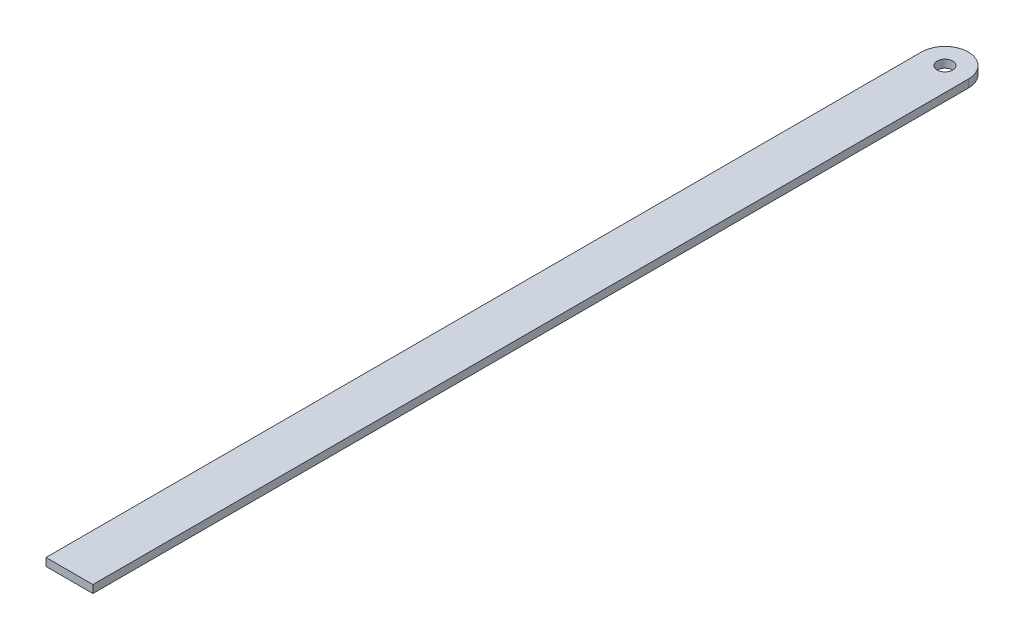
ISO-10303-21;
HEADER;
FILE_DESCRIPTION(('STEP AP214'),'2;1');
FILE_NAME('part.step','',(''),(''),'','','');
FILE_SCHEMA(('AUTOMOTIVE_DESIGN { 1 0 10303 214 1 1 1 1 }'));
ENDSEC;
DATA;
#1=APPLICATION_CONTEXT('core data for automotive mechanical design processes');
#2=APPLICATION_PROTOCOL_DEFINITION('international standard','automotive_design',2000,#1);
#3=PRODUCT_CONTEXT('',#1,'mechanical');
#4=PRODUCT('Part','Part','',(#3));
#5=PRODUCT_RELATED_PRODUCT_CATEGORY('part','',(#4));
#6=PRODUCT_DEFINITION_FORMATION('','',#4);
#7=PRODUCT_DEFINITION_CONTEXT('part definition',#1,'design');
#8=PRODUCT_DEFINITION('design','',#6,#7);
#9=PRODUCT_DEFINITION_SHAPE('','',#8);
#10=(LENGTH_UNIT() NAMED_UNIT(*) SI_UNIT(.MILLI.,.METRE.));
#11=(NAMED_UNIT(*) PLANE_ANGLE_UNIT() SI_UNIT($,.RADIAN.));
#12=(NAMED_UNIT(*) SI_UNIT($,.STERADIAN.) SOLID_ANGLE_UNIT());
#13=UNCERTAINTY_MEASURE_WITH_UNIT(LENGTH_MEASURE(1.E-05),#10,'distance_accuracy_value','');
#14=(GEOMETRIC_REPRESENTATION_CONTEXT(3) GLOBAL_UNCERTAINTY_ASSIGNED_CONTEXT((#13)) GLOBAL_UNIT_ASSIGNED_CONTEXT((#10,
#11,#12)) REPRESENTATION_CONTEXT('',''));
#15=CARTESIAN_POINT('',(0.,0.,0.));
#16=DIRECTION('',(0.,0.,1.));
#17=DIRECTION('',(1.,0.,0.));
#18=AXIS2_PLACEMENT_3D('',#15,#16,#17);
#19=CARTESIAN_POINT('',(4.7625,1.5875,0.));
#20=DIRECTION('',(0.,-1.,0.));
#21=DIRECTION('',(0.,0.,-1.));
#22=AXIS2_PLACEMENT_3D('',#19,#20,#21);
#23=PLANE('',#22);
#24=CARTESIAN_POINT('',(4.7625,1.5875,0.));
#25=DIRECTION('',(0.,1.,0.));
#26=DIRECTION('',(0.,0.,-1.));
#27=AXIS2_PLACEMENT_3D('',#24,#25,#26);
#28=CIRCLE('',#27,4.7625);
#29=CARTESIAN_POINT('',(9.525,1.5875,0.));
#30=VERTEX_POINT('',#29);
#31=CARTESIAN_POINT('',(0.,1.5875,0.));
#32=VERTEX_POINT('',#31);
#33=EDGE_CURVE('E98',#30,#32,#28,.T.);
#34=ORIENTED_EDGE('',*,*,#33,.T.);
#35=DIRECTION('',(0.,0.,1.));
#36=VECTOR('',#35,1.);
#37=CARTESIAN_POINT('',(0.,1.5875,0.));
#38=LINE('',#37,#36);
#39=CARTESIAN_POINT('',(0.,1.5875,177.8));
#40=VERTEX_POINT('',#39);
#41=EDGE_CURVE('E91',#32,#40,#38,.T.);
#42=ORIENTED_EDGE('',*,*,#41,.T.);
#43=DIRECTION('',(1.,0.,0.));
#44=VECTOR('',#43,1.);
#45=CARTESIAN_POINT('',(0.,1.5875,177.8));
#46=LINE('',#45,#44);
#47=CARTESIAN_POINT('',(9.525,1.5875,177.8));
#48=VERTEX_POINT('',#47);
#49=EDGE_CURVE('E96',#40,#48,#46,.T.);
#50=ORIENTED_EDGE('',*,*,#49,.T.);
#51=DIRECTION('',(0.,0.,-1.));
#52=VECTOR('',#51,1.);
#53=CARTESIAN_POINT('',(9.525,1.5875,0.));
#54=LINE('',#53,#52);
#55=EDGE_CURVE('E62',#48,#30,#54,.T.);
#56=ORIENTED_EDGE('',*,*,#55,.T.);
#57=EDGE_LOOP('',(#34,#42,#50,#56));
#58=FACE_BOUND('',#57,.T.);
#59=CARTESIAN_POINT('',(4.7625,1.5875,0.));
#60=DIRECTION('',(0.,1.,0.));
#61=DIRECTION('',(0.,0.,1.));
#62=AXIS2_PLACEMENT_3D('',#59,#60,#61);
#63=CIRCLE('',#62,1.5875);
#64=CARTESIAN_POINT('',(4.7625,1.5875,1.5875));
#65=VERTEX_POINT('',#64);
#66=EDGE_CURVE('E117',#65,#65,#63,.T.);
#67=ORIENTED_EDGE('',*,*,#66,.F.);
#68=EDGE_LOOP('',(#67));
#69=FACE_BOUND('',#68,.T.);
#70=ADVANCED_FACE('F44',(#58,#69),#23,.F.);
#71=CARTESIAN_POINT('',(4.7625,0.,0.));
#72=DIRECTION('',(0.,-1.,0.));
#73=DIRECTION('',(0.,0.,-1.));
#74=AXIS2_PLACEMENT_3D('',#71,#72,#73);
#75=PLANE('',#74);
#76=CARTESIAN_POINT('',(4.7625,0.,0.));
#77=DIRECTION('',(0.,1.,0.));
#78=DIRECTION('',(0.,0.,-1.));
#79=AXIS2_PLACEMENT_3D('',#76,#77,#78);
#80=CIRCLE('',#79,4.7625);
#81=CARTESIAN_POINT('',(9.525,0.,0.));
#82=VERTEX_POINT('',#81);
#83=CARTESIAN_POINT('',(0.,0.,0.));
#84=VERTEX_POINT('',#83);
#85=EDGE_CURVE('E111',#82,#84,#80,.T.);
#86=ORIENTED_EDGE('',*,*,#85,.F.);
#87=DIRECTION('',(0.,0.,-1.));
#88=VECTOR('',#87,1.);
#89=CARTESIAN_POINT('',(9.525,0.,0.));
#90=LINE('',#89,#88);
#91=CARTESIAN_POINT('',(9.525,0.,177.8));
#92=VERTEX_POINT('',#91);
#93=EDGE_CURVE('E88',#92,#82,#90,.T.);
#94=ORIENTED_EDGE('',*,*,#93,.F.);
#95=DIRECTION('',(1.,0.,0.));
#96=VECTOR('',#95,1.);
#97=CARTESIAN_POINT('',(0.,0.,177.8));
#98=LINE('',#97,#96);
#99=CARTESIAN_POINT('',(0.,0.,177.8));
#100=VERTEX_POINT('',#99);
#101=EDGE_CURVE('E79',#100,#92,#98,.T.);
#102=ORIENTED_EDGE('',*,*,#101,.F.);
#103=DIRECTION('',(0.,0.,1.));
#104=VECTOR('',#103,1.);
#105=CARTESIAN_POINT('',(0.,0.,0.));
#106=LINE('',#105,#104);
#107=EDGE_CURVE('E103',#84,#100,#106,.T.);
#108=ORIENTED_EDGE('',*,*,#107,.F.);
#109=EDGE_LOOP('',(#86,#94,#102,#108));
#110=FACE_BOUND('',#109,.T.);
#111=CARTESIAN_POINT('',(4.7625,0.,0.));
#112=DIRECTION('',(0.,1.,0.));
#113=DIRECTION('',(0.,0.,1.));
#114=AXIS2_PLACEMENT_3D('',#111,#112,#113);
#115=CIRCLE('',#114,1.5875);
#116=CARTESIAN_POINT('',(4.7625,0.,1.5875));
#117=VERTEX_POINT('',#116);
#118=EDGE_CURVE('E138',#117,#117,#115,.T.);
#119=ORIENTED_EDGE('',*,*,#118,.T.);
#120=EDGE_LOOP('',(#119));
#121=FACE_BOUND('',#120,.T.);
#122=ADVANCED_FACE('F131',(#110,#121),#75,.T.);
#123=CARTESIAN_POINT('',(4.7625,1.5875,0.));
#124=DIRECTION('',(0.,-1.,0.));
#125=DIRECTION('',(0.,0.,-1.));
#126=AXIS2_PLACEMENT_3D('',#123,#124,#125);
#127=CYLINDRICAL_SURFACE('',#126,4.7625);
#128=ORIENTED_EDGE('',*,*,#85,.T.);
#129=DIRECTION('',(0.,-1.,0.));
#130=VECTOR('',#129,1.);
#131=CARTESIAN_POINT('',(0.,1.5875,0.));
#132=LINE('',#131,#130);
#133=EDGE_CURVE('E11',#32,#84,#132,.T.);
#134=ORIENTED_EDGE('',*,*,#133,.F.);
#135=ORIENTED_EDGE('',*,*,#33,.F.);
#136=DIRECTION('',(0.,-1.,0.));
#137=VECTOR('',#136,1.);
#138=CARTESIAN_POINT('',(9.525,1.5875,0.));
#139=LINE('',#138,#137);
#140=EDGE_CURVE('E109',#30,#82,#139,.T.);
#141=ORIENTED_EDGE('',*,*,#140,.T.);
#142=EDGE_LOOP('',(#128,#134,#135,#141));
#143=FACE_BOUND('',#142,.T.);
#144=ADVANCED_FACE('F50',(#143),#127,.T.);
#145=CARTESIAN_POINT('',(0.,1.5875,0.));
#146=DIRECTION('',(1.,0.,0.));
#147=DIRECTION('',(0.,0.,-1.));
#148=AXIS2_PLACEMENT_3D('',#145,#146,#147);
#149=PLANE('',#148);
#150=ORIENTED_EDGE('',*,*,#107,.T.);
#151=DIRECTION('',(0.,-1.,0.));
#152=VECTOR('',#151,1.);
#153=CARTESIAN_POINT('',(0.,1.5875,177.8));
#154=LINE('',#153,#152);
#155=EDGE_CURVE('E54',#40,#100,#154,.T.);
#156=ORIENTED_EDGE('',*,*,#155,.F.);
#157=ORIENTED_EDGE('',*,*,#41,.F.);
#158=ORIENTED_EDGE('',*,*,#133,.T.);
#159=EDGE_LOOP('',(#150,#156,#157,#158));
#160=FACE_BOUND('',#159,.T.);
#161=ADVANCED_FACE('F105',(#160),#149,.F.);
#162=CARTESIAN_POINT('',(0.,1.5875,177.8));
#163=DIRECTION('',(0.,0.,-1.));
#164=DIRECTION('',(-1.,0.,0.));
#165=AXIS2_PLACEMENT_3D('',#162,#163,#164);
#166=PLANE('',#165);
#167=ORIENTED_EDGE('',*,*,#101,.T.);
#168=DIRECTION('',(0.,-1.,0.));
#169=VECTOR('',#168,1.);
#170=CARTESIAN_POINT('',(9.525,1.5875,177.8));
#171=LINE('',#170,#169);
#172=EDGE_CURVE('E104',#48,#92,#171,.T.);
#173=ORIENTED_EDGE('',*,*,#172,.F.);
#174=ORIENTED_EDGE('',*,*,#49,.F.);
#175=ORIENTED_EDGE('',*,*,#155,.T.);
#176=EDGE_LOOP('',(#167,#173,#174,#175));
#177=FACE_BOUND('',#176,.T.);
#178=ADVANCED_FACE('F106',(#177),#166,.F.);
#179=CARTESIAN_POINT('',(9.525,1.5875,0.));
#180=DIRECTION('',(-1.,0.,0.));
#181=DIRECTION('',(0.,0.,1.));
#182=AXIS2_PLACEMENT_3D('',#179,#180,#181);
#183=PLANE('',#182);
#184=ORIENTED_EDGE('',*,*,#93,.T.);
#185=ORIENTED_EDGE('',*,*,#140,.F.);
#186=ORIENTED_EDGE('',*,*,#55,.F.);
#187=ORIENTED_EDGE('',*,*,#172,.T.);
#188=EDGE_LOOP('',(#184,#185,#186,#187));
#189=FACE_BOUND('',#188,.T.);
#190=ADVANCED_FACE('F126',(#189),#183,.F.);
#191=CARTESIAN_POINT('',(4.7625,1.5875,0.));
#192=DIRECTION('',(0.,-1.,0.));
#193=DIRECTION('',(0.,0.,-1.));
#194=AXIS2_PLACEMENT_3D('',#191,#192,#193);
#195=CYLINDRICAL_SURFACE('',#194,1.5875);
#196=ORIENTED_EDGE('',*,*,#66,.T.);
#197=EDGE_LOOP('',(#196));
#198=FACE_BOUND('',#197,.T.);
#199=ORIENTED_EDGE('',*,*,#118,.F.);
#200=EDGE_LOOP('',(#199));
#201=FACE_BOUND('',#200,.T.);
#202=ADVANCED_FACE('F145',(#198,#201),#195,.F.);
#203=CLOSED_SHELL('',(#70,#122,#144,#161,#178,#190,#202));
#204=MANIFOLD_SOLID_BREP('B2',#203);
#205=ADVANCED_BREP_SHAPE_REPRESENTATION('',(#18,#204),#14);
#206=SHAPE_DEFINITION_REPRESENTATION(#9,#205);
ENDSEC;
END-ISO-10303-21;
